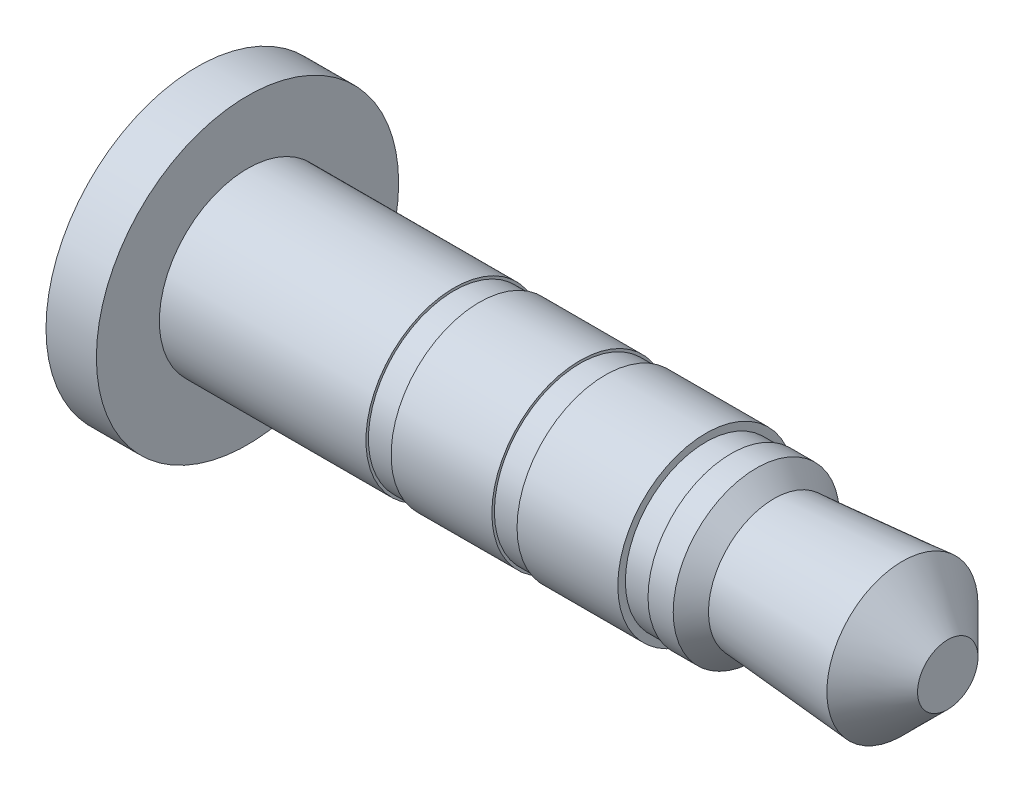
ISO-10303-21;
HEADER;
FILE_DESCRIPTION(('STEP AP214'),'2;1');
FILE_NAME('part.step','',(''),(''),'','','');
FILE_SCHEMA(('AUTOMOTIVE_DESIGN { 1 0 10303 214 1 1 1 1 }'));
ENDSEC;
DATA;
#1=APPLICATION_CONTEXT('core data for automotive mechanical design processes');
#2=APPLICATION_PROTOCOL_DEFINITION('international standard','automotive_design',2000,#1);
#3=PRODUCT_CONTEXT('',#1,'mechanical');
#4=PRODUCT('Part','Part','',(#3));
#5=PRODUCT_RELATED_PRODUCT_CATEGORY('part','',(#4));
#6=PRODUCT_DEFINITION_FORMATION('','',#4);
#7=PRODUCT_DEFINITION_CONTEXT('part definition',#1,'design');
#8=PRODUCT_DEFINITION('design','',#6,#7);
#9=PRODUCT_DEFINITION_SHAPE('','',#8);
#10=(LENGTH_UNIT() NAMED_UNIT(*) SI_UNIT(.MILLI.,.METRE.));
#11=(NAMED_UNIT(*) PLANE_ANGLE_UNIT() SI_UNIT($,.RADIAN.));
#12=(NAMED_UNIT(*) SI_UNIT($,.STERADIAN.) SOLID_ANGLE_UNIT());
#13=UNCERTAINTY_MEASURE_WITH_UNIT(LENGTH_MEASURE(1.E-05),#10,'distance_accuracy_value','');
#14=(GEOMETRIC_REPRESENTATION_CONTEXT(3) GLOBAL_UNCERTAINTY_ASSIGNED_CONTEXT((#13)) GLOBAL_UNIT_ASSIGNED_CONTEXT((#10,
#11,#12)) REPRESENTATION_CONTEXT('',''));
#15=CARTESIAN_POINT('',(0.,0.,0.));
#16=DIRECTION('',(0.,0.,1.));
#17=DIRECTION('',(1.,0.,0.));
#18=AXIS2_PLACEMENT_3D('',#15,#16,#17);
#19=CARTESIAN_POINT('',(13.9,0.,0.));
#20=DIRECTION('',(1.,0.,0.));
#21=DIRECTION('',(0.,0.,-1.));
#22=AXIS2_PLACEMENT_3D('',#19,#20,#21);
#23=CYLINDRICAL_SURFACE('',#22,1.74999999999999);
#24=CARTESIAN_POINT('',(9.10000000000001,0.,0.));
#25=DIRECTION('',(-1.,0.,0.));
#26=DIRECTION('',(0.,0.,1.));
#27=AXIS2_PLACEMENT_3D('',#24,#25,#26);
#28=CIRCLE('',#27,1.74999999999999);
#29=CARTESIAN_POINT('',(9.10000000000001,0.,1.74999999999999));
#30=VERTEX_POINT('',#29);
#31=EDGE_CURVE('E65',#30,#30,#28,.T.);
#32=ORIENTED_EDGE('',*,*,#31,.T.);
#33=EDGE_LOOP('',(#32));
#34=FACE_BOUND('',#33,.T.);
#35=CARTESIAN_POINT('',(7.10000000000001,0.,0.));
#36=DIRECTION('',(-1.,0.,0.));
#37=DIRECTION('',(0.,0.,1.));
#38=AXIS2_PLACEMENT_3D('',#35,#36,#37);
#39=CIRCLE('',#38,1.74999999999999);
#40=CARTESIAN_POINT('',(7.10000000000001,0.,1.74999999999999));
#41=VERTEX_POINT('',#40);
#42=EDGE_CURVE('E86',#41,#41,#39,.T.);
#43=ORIENTED_EDGE('',*,*,#42,.F.);
#44=EDGE_LOOP('',(#43));
#45=FACE_BOUND('',#44,.T.);
#46=ADVANCED_FACE('F37',(#34,#45),#23,.T.);
#47=CARTESIAN_POINT('',(9.10000000000001,1.74999999999999,0.));
#48=DIRECTION('',(1.,0.,0.));
#49=DIRECTION('',(0.,0.,-1.));
#50=AXIS2_PLACEMENT_3D('',#47,#48,#49);
#51=PLANE('',#50);
#52=ORIENTED_EDGE('',*,*,#31,.F.);
#53=EDGE_LOOP('',(#52));
#54=FACE_BOUND('',#53,.T.);
#55=CARTESIAN_POINT('',(9.10000000000001,0.,0.));
#56=DIRECTION('',(-1.,0.,0.));
#57=DIRECTION('',(0.,0.,1.));
#58=AXIS2_PLACEMENT_3D('',#55,#56,#57);
#59=CIRCLE('',#58,1.59999999999999);
#60=CARTESIAN_POINT('',(9.10000000000001,0.,1.59999999999999));
#61=VERTEX_POINT('',#60);
#62=EDGE_CURVE('E68',#61,#61,#59,.T.);
#63=ORIENTED_EDGE('',*,*,#62,.T.);
#64=EDGE_LOOP('',(#63));
#65=FACE_BOUND('',#64,.T.);
#66=ADVANCED_FACE('F116',(#54,#65),#51,.T.);
#67=CARTESIAN_POINT('',(0.,0.,0.));
#68=DIRECTION('',(-1.,0.,0.));
#69=DIRECTION('',(0.,0.,1.));
#70=AXIS2_PLACEMENT_3D('',#67,#68,#69);
#71=CYLINDRICAL_SURFACE('',#70,1.59999999999999);
#72=CARTESIAN_POINT('',(9.60000000000001,0.,0.));
#73=DIRECTION('',(-1.,0.,0.));
#74=DIRECTION('',(0.,0.,1.));
#75=AXIS2_PLACEMENT_3D('',#72,#73,#74);
#76=CIRCLE('',#75,1.59999999999999);
#77=CARTESIAN_POINT('',(9.60000000000001,0.,1.59999999999999));
#78=VERTEX_POINT('',#77);
#79=EDGE_CURVE('E71',#78,#78,#76,.T.);
#80=ORIENTED_EDGE('',*,*,#79,.T.);
#81=EDGE_LOOP('',(#80));
#82=FACE_BOUND('',#81,.T.);
#83=ORIENTED_EDGE('',*,*,#62,.F.);
#84=EDGE_LOOP('',(#83));
#85=FACE_BOUND('',#84,.T.);
#86=ADVANCED_FACE('F121',(#82,#85),#71,.T.);
#87=CARTESIAN_POINT('',(9.60000000000001,1.64999999999999,0.));
#88=DIRECTION('',(-1.,0.,0.));
#89=DIRECTION('',(0.,0.,1.));
#90=AXIS2_PLACEMENT_3D('',#87,#88,#89);
#91=PLANE('',#90);
#92=CARTESIAN_POINT('',(9.60000000000001,0.,0.));
#93=DIRECTION('',(-1.,0.,0.));
#94=DIRECTION('',(0.,0.,1.));
#95=AXIS2_PLACEMENT_3D('',#92,#93,#94);
#96=CIRCLE('',#95,1.64999999999999);
#97=CARTESIAN_POINT('',(9.60000000000001,0.,1.64999999999999));
#98=VERTEX_POINT('',#97);
#99=EDGE_CURVE('E74',#98,#98,#96,.T.);
#100=ORIENTED_EDGE('',*,*,#99,.T.);
#101=EDGE_LOOP('',(#100));
#102=FACE_BOUND('',#101,.T.);
#103=ORIENTED_EDGE('',*,*,#79,.F.);
#104=EDGE_LOOP('',(#103));
#105=FACE_BOUND('',#104,.T.);
#106=ADVANCED_FACE('F151',(#102,#105),#91,.T.);
#107=CARTESIAN_POINT('',(13.9,0.,0.));
#108=DIRECTION('',(-1.,0.,0.));
#109=DIRECTION('',(0.,0.,1.));
#110=AXIS2_PLACEMENT_3D('',#107,#108,#109);
#111=PLANE('',#110);
#112=CARTESIAN_POINT('',(13.9,0.,0.));
#113=DIRECTION('',(1.,0.,0.));
#114=DIRECTION('',(0.,0.,-1.));
#115=AXIS2_PLACEMENT_3D('',#112,#113,#114);
#116=CIRCLE('',#115,0.600000000000001);
#117=CARTESIAN_POINT('',(13.9,0.,-0.600000000000001));
#118=VERTEX_POINT('',#117);
#119=EDGE_CURVE('E51',#118,#118,#116,.T.);
#120=ORIENTED_EDGE('',*,*,#119,.T.);
#121=EDGE_LOOP('',(#120));
#122=FACE_BOUND('',#121,.T.);
#123=ADVANCED_FACE('F154',(#122),#111,.F.);
#124=CARTESIAN_POINT('',(13.,0.,0.));
#125=DIRECTION('',(-1.,0.,0.));
#126=DIRECTION('',(0.,0.,1.));
#127=AXIS2_PLACEMENT_3D('',#124,#125,#126);
#128=CONICAL_SURFACE('',#127,1.5,0.785398163397448);
#129=ORIENTED_EDGE('',*,*,#119,.F.);
#130=EDGE_LOOP('',(#129));
#131=FACE_BOUND('',#130,.T.);
#132=CARTESIAN_POINT('',(13.,0.,0.));
#133=DIRECTION('',(1.,0.,0.));
#134=DIRECTION('',(0.,0.,-1.));
#135=AXIS2_PLACEMENT_3D('',#132,#133,#134);
#136=CIRCLE('',#135,1.5);
#137=CARTESIAN_POINT('',(13.,0.,-1.5));
#138=VERTEX_POINT('',#137);
#139=EDGE_CURVE('E56',#138,#138,#136,.T.);
#140=ORIENTED_EDGE('',*,*,#139,.T.);
#141=EDGE_LOOP('',(#140));
#142=FACE_BOUND('',#141,.T.);
#143=ADVANCED_FACE('F169',(#131,#142),#128,.T.);
#144=CARTESIAN_POINT('',(10.45,0.,0.));
#145=DIRECTION('',(1.,0.,0.));
#146=DIRECTION('',(0.,0.,-1.));
#147=AXIS2_PLACEMENT_3D('',#144,#145,#146);
#148=CONICAL_SURFACE('',#147,1.3,0.0782711405212767);
#149=ORIENTED_EDGE('',*,*,#139,.F.);
#150=EDGE_LOOP('',(#149));
#151=FACE_BOUND('',#150,.T.);
#152=CARTESIAN_POINT('',(10.45,0.,0.));
#153=DIRECTION('',(1.,0.,0.));
#154=DIRECTION('',(0.,0.,-1.));
#155=AXIS2_PLACEMENT_3D('',#152,#153,#154);
#156=CIRCLE('',#155,1.3);
#157=CARTESIAN_POINT('',(10.45,0.,-1.3));
#158=VERTEX_POINT('',#157);
#159=EDGE_CURVE('E59',#158,#158,#156,.T.);
#160=ORIENTED_EDGE('',*,*,#159,.T.);
#161=EDGE_LOOP('',(#160));
#162=FACE_BOUND('',#161,.T.);
#163=ADVANCED_FACE('F165',(#151,#162),#148,.T.);
#164=CARTESIAN_POINT('',(10.,0.,0.));
#165=DIRECTION('',(-1.,0.,0.));
#166=DIRECTION('',(0.,0.,1.));
#167=AXIS2_PLACEMENT_3D('',#164,#165,#166);
#168=CONICAL_SURFACE('',#167,1.75,0.785398163397447);
#169=ORIENTED_EDGE('',*,*,#159,.F.);
#170=EDGE_LOOP('',(#169));
#171=FACE_BOUND('',#170,.T.);
#172=CARTESIAN_POINT('',(10.1,0.,0.));
#173=DIRECTION('',(-1.,0.,0.));
#174=DIRECTION('',(0.,0.,1.));
#175=AXIS2_PLACEMENT_3D('',#172,#173,#174);
#176=CIRCLE('',#175,1.64999999999999);
#177=CARTESIAN_POINT('',(10.1,0.,1.64999999999999));
#178=VERTEX_POINT('',#177);
#179=EDGE_CURVE('E62',#178,#178,#176,.T.);
#180=ORIENTED_EDGE('',*,*,#179,.F.);
#181=EDGE_LOOP('',(#180));
#182=FACE_BOUND('',#181,.T.);
#183=ADVANCED_FACE('F160',(#171,#182),#168,.T.);
#184=CARTESIAN_POINT('',(0.,0.,0.));
#185=DIRECTION('',(-1.,0.,0.));
#186=DIRECTION('',(0.,0.,1.));
#187=AXIS2_PLACEMENT_3D('',#184,#185,#186);
#188=CYLINDRICAL_SURFACE('',#187,1.64999999999999);
#189=ORIENTED_EDGE('',*,*,#179,.T.);
#190=EDGE_LOOP('',(#189));
#191=FACE_BOUND('',#190,.T.);
#192=ORIENTED_EDGE('',*,*,#99,.F.);
#193=EDGE_LOOP('',(#192));
#194=FACE_BOUND('',#193,.T.);
#195=ADVANCED_FACE('F132',(#191,#194),#188,.T.);
#196=CARTESIAN_POINT('',(7.10000000000001,1.74999999999999,0.));
#197=DIRECTION('',(-1.,0.,0.));
#198=DIRECTION('',(0.,0.,1.));
#199=AXIS2_PLACEMENT_3D('',#196,#197,#198);
#200=PLANE('',#199);
#201=ORIENTED_EDGE('',*,*,#42,.T.);
#202=EDGE_LOOP('',(#201));
#203=FACE_BOUND('',#202,.T.);
#204=CARTESIAN_POINT('',(7.10000000000001,0.,0.));
#205=DIRECTION('',(-1.,0.,0.));
#206=DIRECTION('',(0.,0.,1.));
#207=AXIS2_PLACEMENT_3D('',#204,#205,#206);
#208=CIRCLE('',#207,1.69999999999999);
#209=CARTESIAN_POINT('',(7.10000000000001,0.,1.69999999999999));
#210=VERTEX_POINT('',#209);
#211=EDGE_CURVE('E77',#210,#210,#208,.T.);
#212=ORIENTED_EDGE('',*,*,#211,.F.);
#213=EDGE_LOOP('',(#212));
#214=FACE_BOUND('',#213,.T.);
#215=ADVANCED_FACE('F128',(#203,#214),#200,.T.);
#216=CARTESIAN_POINT('',(0.,0.,0.));
#217=DIRECTION('',(-1.,0.,0.));
#218=DIRECTION('',(0.,0.,1.));
#219=AXIS2_PLACEMENT_3D('',#216,#217,#218);
#220=CYLINDRICAL_SURFACE('',#219,1.69999999999999);
#221=ORIENTED_EDGE('',*,*,#211,.T.);
#222=EDGE_LOOP('',(#221));
#223=FACE_BOUND('',#222,.T.);
#224=CARTESIAN_POINT('',(6.60000000000001,0.,0.));
#225=DIRECTION('',(-1.,0.,0.));
#226=DIRECTION('',(0.,0.,1.));
#227=AXIS2_PLACEMENT_3D('',#224,#225,#226);
#228=CIRCLE('',#227,1.69999999999999);
#229=CARTESIAN_POINT('',(6.60000000000001,0.,1.69999999999999));
#230=VERTEX_POINT('',#229);
#231=EDGE_CURVE('E80',#230,#230,#228,.T.);
#232=ORIENTED_EDGE('',*,*,#231,.F.);
#233=EDGE_LOOP('',(#232));
#234=FACE_BOUND('',#233,.T.);
#235=ADVANCED_FACE('F131',(#223,#234),#220,.T.);
#236=CARTESIAN_POINT('',(6.60000000000001,1.74999999999999,0.));
#237=DIRECTION('',(1.,0.,0.));
#238=DIRECTION('',(0.,0.,-1.));
#239=AXIS2_PLACEMENT_3D('',#236,#237,#238);
#240=PLANE('',#239);
#241=ORIENTED_EDGE('',*,*,#231,.T.);
#242=EDGE_LOOP('',(#241));
#243=FACE_BOUND('',#242,.T.);
#244=CARTESIAN_POINT('',(6.60000000000001,0.,0.));
#245=DIRECTION('',(-1.,0.,0.));
#246=DIRECTION('',(0.,0.,1.));
#247=AXIS2_PLACEMENT_3D('',#244,#245,#246);
#248=CIRCLE('',#247,1.74999999999999);
#249=CARTESIAN_POINT('',(6.60000000000001,0.,1.74999999999999));
#250=VERTEX_POINT('',#249);
#251=EDGE_CURVE('E83',#250,#250,#248,.T.);
#252=ORIENTED_EDGE('',*,*,#251,.F.);
#253=EDGE_LOOP('',(#252));
#254=FACE_BOUND('',#253,.T.);
#255=ADVANCED_FACE('F113',(#243,#254),#240,.T.);
#256=CARTESIAN_POINT('',(4.60000000000001,0.,0.));
#257=DIRECTION('',(1.,0.,0.));
#258=DIRECTION('',(0.,0.,-1.));
#259=AXIS2_PLACEMENT_3D('',#256,#257,#258);
#260=CIRCLE('',#259,1.74999999999999);
#261=CARTESIAN_POINT('',(4.60000000000001,0.,-1.74999999999999));
#262=VERTEX_POINT('',#261);
#263=EDGE_CURVE('E95',#262,#262,#260,.T.);
#264=ORIENTED_EDGE('',*,*,#263,.T.);
#265=EDGE_LOOP('',(#264));
#266=FACE_BOUND('',#265,.T.);
#267=ORIENTED_EDGE('',*,*,#251,.T.);
#268=EDGE_LOOP('',(#267));
#269=FACE_BOUND('',#268,.T.);
#270=ADVANCED_FACE('F107',(#266,#269),#23,.T.);
#271=CARTESIAN_POINT('',(4.10000000000001,1.74999999999999,0.));
#272=DIRECTION('',(-1.,0.,0.));
#273=DIRECTION('',(0.,0.,1.));
#274=AXIS2_PLACEMENT_3D('',#271,#272,#273);
#275=PLANE('',#274);
#276=CARTESIAN_POINT('',(4.10000000000001,0.,0.));
#277=DIRECTION('',(1.,0.,0.));
#278=DIRECTION('',(0.,0.,-1.));
#279=AXIS2_PLACEMENT_3D('',#276,#277,#278);
#280=CIRCLE('',#279,1.69999999999999);
#281=CARTESIAN_POINT('',(4.10000000000001,0.,-1.69999999999999));
#282=VERTEX_POINT('',#281);
#283=EDGE_CURVE('E89',#282,#282,#280,.T.);
#284=ORIENTED_EDGE('',*,*,#283,.F.);
#285=EDGE_LOOP('',(#284));
#286=FACE_BOUND('',#285,.T.);
#287=CARTESIAN_POINT('',(4.10000000000001,0.,0.));
#288=DIRECTION('',(1.,0.,0.));
#289=DIRECTION('',(0.,0.,-1.));
#290=AXIS2_PLACEMENT_3D('',#287,#288,#289);
#291=CIRCLE('',#290,1.74999999999999);
#292=CARTESIAN_POINT('',(4.10000000000001,0.,-1.74999999999999));
#293=VERTEX_POINT('',#292);
#294=EDGE_CURVE('E98',#293,#293,#291,.T.);
#295=ORIENTED_EDGE('',*,*,#294,.T.);
#296=EDGE_LOOP('',(#295));
#297=FACE_BOUND('',#296,.T.);
#298=ADVANCED_FACE('F102',(#286,#297),#275,.F.);
#299=CARTESIAN_POINT('',(7.10000000000001,0.,0.));
#300=DIRECTION('',(1.,0.,0.));
#301=DIRECTION('',(0.,0.,-1.));
#302=AXIS2_PLACEMENT_3D('',#299,#300,#301);
#303=CYLINDRICAL_SURFACE('',#302,1.69999999999999);
#304=CARTESIAN_POINT('',(4.60000000000001,0.,0.));
#305=DIRECTION('',(1.,0.,0.));
#306=DIRECTION('',(0.,0.,-1.));
#307=AXIS2_PLACEMENT_3D('',#304,#305,#306);
#308=CIRCLE('',#307,1.69999999999999);
#309=CARTESIAN_POINT('',(4.60000000000001,0.,-1.69999999999999));
#310=VERTEX_POINT('',#309);
#311=EDGE_CURVE('E92',#310,#310,#308,.T.);
#312=ORIENTED_EDGE('',*,*,#311,.F.);
#313=EDGE_LOOP('',(#312));
#314=FACE_BOUND('',#313,.T.);
#315=ORIENTED_EDGE('',*,*,#283,.T.);
#316=EDGE_LOOP('',(#315));
#317=FACE_BOUND('',#316,.T.);
#318=ADVANCED_FACE('F285',(#314,#317),#303,.T.);
#319=CARTESIAN_POINT('',(4.60000000000001,1.74999999999999,0.));
#320=DIRECTION('',(1.,0.,0.));
#321=DIRECTION('',(0.,0.,-1.));
#322=AXIS2_PLACEMENT_3D('',#319,#320,#321);
#323=PLANE('',#322);
#324=ORIENTED_EDGE('',*,*,#263,.F.);
#325=EDGE_LOOP('',(#324));
#326=FACE_BOUND('',#325,.T.);
#327=ORIENTED_EDGE('',*,*,#311,.T.);
#328=EDGE_LOOP('',(#327));
#329=FACE_BOUND('',#328,.T.);
#330=ADVANCED_FACE('F180',(#326,#329),#323,.F.);
#331=CARTESIAN_POINT('',(-0.999999999999999,0.,0.));
#332=DIRECTION('',(-1.,0.,0.));
#333=DIRECTION('',(0.,0.,1.));
#334=AXIS2_PLACEMENT_3D('',#331,#332,#333);
#335=PLANE('',#334);
#336=CARTESIAN_POINT('',(-1.,0.,0.));
#337=DIRECTION('',(1.,0.,0.));
#338=DIRECTION('',(0.,0.,-1.));
#339=AXIS2_PLACEMENT_3D('',#336,#337,#338);
#340=CIRCLE('',#339,3.);
#341=CARTESIAN_POINT('',(-1.,0.,-3.));
#342=VERTEX_POINT('',#341);
#343=EDGE_CURVE('E47',#342,#342,#340,.T.);
#344=ORIENTED_EDGE('',*,*,#343,.F.);
#345=EDGE_LOOP('',(#344));
#346=FACE_BOUND('',#345,.T.);
#347=ADVANCED_FACE('F177',(#346),#335,.T.);
#348=CARTESIAN_POINT('',(13.9,0.,0.));
#349=DIRECTION('',(1.,0.,0.));
#350=DIRECTION('',(0.,0.,-1.));
#351=AXIS2_PLACEMENT_3D('',#348,#349,#350);
#352=CYLINDRICAL_SURFACE('',#351,3.);
#353=ORIENTED_EDGE('',*,*,#343,.T.);
#354=EDGE_LOOP('',(#353));
#355=FACE_BOUND('',#354,.T.);
#356=CARTESIAN_POINT('',(0.,0.,0.));
#357=DIRECTION('',(1.,0.,0.));
#358=DIRECTION('',(0.,0.,-1.));
#359=AXIS2_PLACEMENT_3D('',#356,#357,#358);
#360=CIRCLE('',#359,3.);
#361=CARTESIAN_POINT('',(0.,0.,-3.));
#362=VERTEX_POINT('',#361);
#363=EDGE_CURVE('E43',#362,#362,#360,.T.);
#364=ORIENTED_EDGE('',*,*,#363,.F.);
#365=EDGE_LOOP('',(#364));
#366=FACE_BOUND('',#365,.T.);
#367=ADVANCED_FACE('F111',(#355,#366),#352,.T.);
#368=CARTESIAN_POINT('',(0.,0.,0.));
#369=DIRECTION('',(1.,0.,0.));
#370=DIRECTION('',(0.,0.,-1.));
#371=AXIS2_PLACEMENT_3D('',#368,#369,#370);
#372=PLANE('',#371);
#373=ORIENTED_EDGE('',*,*,#363,.T.);
#374=EDGE_LOOP('',(#373));
#375=FACE_BOUND('',#374,.T.);
#376=CARTESIAN_POINT('',(0.,0.,0.));
#377=DIRECTION('',(1.,0.,0.));
#378=DIRECTION('',(0.,0.,-1.));
#379=AXIS2_PLACEMENT_3D('',#376,#377,#378);
#380=CIRCLE('',#379,1.74999999999998);
#381=CARTESIAN_POINT('',(0.,0.,-1.74999999999998));
#382=VERTEX_POINT('',#381);
#383=EDGE_CURVE('E10',#382,#382,#380,.T.);
#384=ORIENTED_EDGE('',*,*,#383,.F.);
#385=EDGE_LOOP('',(#384));
#386=FACE_BOUND('',#385,.T.);
#387=ADVANCED_FACE('F106',(#375,#386),#372,.T.);
#388=ORIENTED_EDGE('',*,*,#294,.F.);
#389=EDGE_LOOP('',(#388));
#390=FACE_BOUND('',#389,.T.);
#391=ORIENTED_EDGE('',*,*,#383,.T.);
#392=EDGE_LOOP('',(#391));
#393=FACE_BOUND('',#392,.T.);
#394=ADVANCED_FACE('F104',(#390,#393),#23,.T.);
#395=CLOSED_SHELL('',(#46,#66,#86,#106,#123,#143,#163,#183,#195,#215,#235,#255,#270,#298,#318,
#330,#347,#367,#387,#394));
#396=MANIFOLD_SOLID_BREP('B2',#395);
#397=ADVANCED_BREP_SHAPE_REPRESENTATION('',(#18,#396),#14);
#398=SHAPE_DEFINITION_REPRESENTATION(#9,#397);
ENDSEC;
END-ISO-10303-21;
